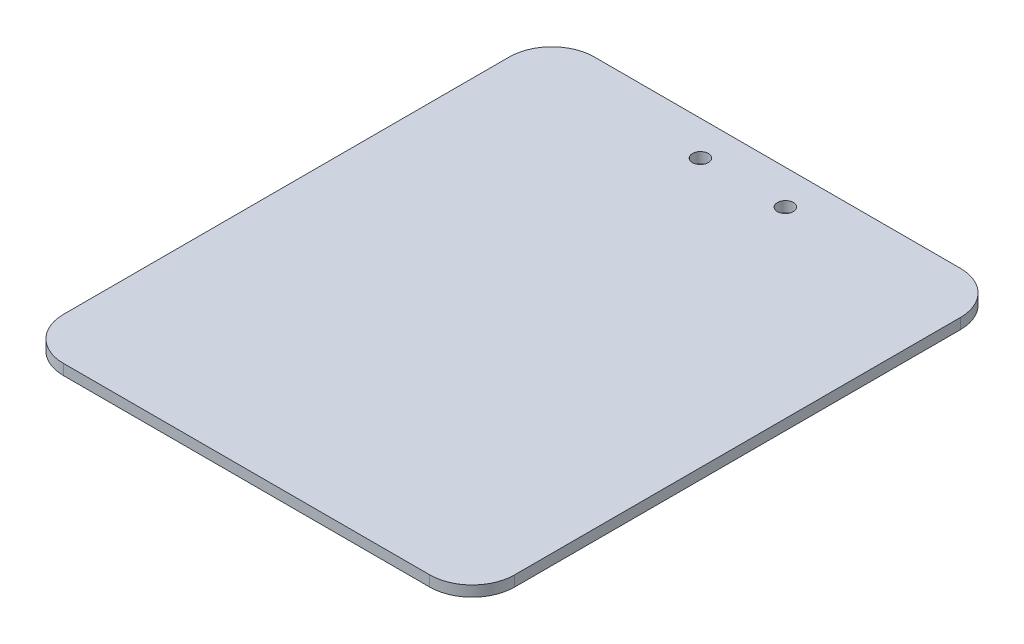
ISO-10303-21;
HEADER;
FILE_DESCRIPTION(('STEP AP214'),'2;1');
FILE_NAME('part.step','',(''),(''),'','','');
FILE_SCHEMA(('AUTOMOTIVE_DESIGN { 1 0 10303 214 1 1 1 1 }'));
ENDSEC;
DATA;
#1=APPLICATION_CONTEXT('core data for automotive mechanical design processes');
#2=APPLICATION_PROTOCOL_DEFINITION('international standard','automotive_design',2000,#1);
#3=PRODUCT_CONTEXT('',#1,'mechanical');
#4=PRODUCT('Part','Part','',(#3));
#5=PRODUCT_RELATED_PRODUCT_CATEGORY('part','',(#4));
#6=PRODUCT_DEFINITION_FORMATION('','',#4);
#7=PRODUCT_DEFINITION_CONTEXT('part definition',#1,'design');
#8=PRODUCT_DEFINITION('design','',#6,#7);
#9=PRODUCT_DEFINITION_SHAPE('','',#8);
#10=(LENGTH_UNIT() NAMED_UNIT(*) SI_UNIT(.MILLI.,.METRE.));
#11=(NAMED_UNIT(*) PLANE_ANGLE_UNIT() SI_UNIT($,.RADIAN.));
#12=(NAMED_UNIT(*) SI_UNIT($,.STERADIAN.) SOLID_ANGLE_UNIT());
#13=UNCERTAINTY_MEASURE_WITH_UNIT(LENGTH_MEASURE(1.E-05),#10,'distance_accuracy_value','');
#14=(GEOMETRIC_REPRESENTATION_CONTEXT(3) GLOBAL_UNCERTAINTY_ASSIGNED_CONTEXT((#13)) GLOBAL_UNIT_ASSIGNED_CONTEXT((#10,
#11,#12)) REPRESENTATION_CONTEXT('',''));
#15=CARTESIAN_POINT('',(0.,0.,0.));
#16=DIRECTION('',(0.,0.,1.));
#17=DIRECTION('',(1.,0.,0.));
#18=AXIS2_PLACEMENT_3D('',#15,#16,#17);
#19=CARTESIAN_POINT('',(8.,2.,-8.));
#20=DIRECTION('',(0.,-1.,0.));
#21=DIRECTION('',(0.,0.,-1.));
#22=AXIS2_PLACEMENT_3D('',#19,#20,#21);
#23=PLANE('',#22);
#24=CARTESIAN_POINT('',(8.,2.,-8.));
#25=DIRECTION('',(0.,1.,0.));
#26=DIRECTION('',(0.,0.,-1.));
#27=AXIS2_PLACEMENT_3D('',#24,#25,#26);
#28=CIRCLE('',#27,8.);
#29=CARTESIAN_POINT('',(0.,2.,-8.00000000000006));
#30=VERTEX_POINT('',#29);
#31=CARTESIAN_POINT('',(8.00000000000006,2.,0.));
#32=VERTEX_POINT('',#31);
#33=EDGE_CURVE('E170',#30,#32,#28,.T.);
#34=ORIENTED_EDGE('',*,*,#33,.T.);
#35=DIRECTION('',(1.,0.,0.));
#36=VECTOR('',#35,1.);
#37=CARTESIAN_POINT('',(8.00000000000006,2.,0.));
#38=LINE('',#37,#36);
#39=CARTESIAN_POINT('',(77.,2.,0.));
#40=VERTEX_POINT('',#39);
#41=EDGE_CURVE('E106',#32,#40,#38,.T.);
#42=ORIENTED_EDGE('',*,*,#41,.T.);
#43=CARTESIAN_POINT('',(77.,2.,-8.));
#44=DIRECTION('',(0.,1.,0.));
#45=DIRECTION('',(0.,0.,1.));
#46=AXIS2_PLACEMENT_3D('',#43,#44,#45);
#47=CIRCLE('',#46,8.);
#48=CARTESIAN_POINT('',(85.,2.,-8.00000000000006));
#49=VERTEX_POINT('',#48);
#50=EDGE_CURVE('E191',#40,#49,#47,.T.);
#51=ORIENTED_EDGE('',*,*,#50,.T.);
#52=DIRECTION('',(0.,0.,-1.));
#53=VECTOR('',#52,1.);
#54=CARTESIAN_POINT('',(85.,2.,-8.00000000000006));
#55=LINE('',#54,#53);
#56=CARTESIAN_POINT('',(85.,2.,-91.9999999999999));
#57=VERTEX_POINT('',#56);
#58=EDGE_CURVE('E205',#49,#57,#55,.T.);
#59=ORIENTED_EDGE('',*,*,#58,.T.);
#60=CARTESIAN_POINT('',(77.,2.,-92.));
#61=DIRECTION('',(0.,1.,0.));
#62=DIRECTION('',(0.,0.,-1.));
#63=AXIS2_PLACEMENT_3D('',#60,#61,#62);
#64=CIRCLE('',#63,7.99999999999999);
#65=CARTESIAN_POINT('',(76.9999999999999,2.,-100.));
#66=VERTEX_POINT('',#65);
#67=EDGE_CURVE('E125',#57,#66,#64,.T.);
#68=ORIENTED_EDGE('',*,*,#67,.T.);
#69=DIRECTION('',(-1.,0.,0.));
#70=VECTOR('',#69,1.);
#71=CARTESIAN_POINT('',(8.00000000000006,2.,-100.));
#72=LINE('',#71,#70);
#73=CARTESIAN_POINT('',(8.00000000000006,2.,-100.));
#74=VERTEX_POINT('',#73);
#75=EDGE_CURVE('E119',#66,#74,#72,.T.);
#76=ORIENTED_EDGE('',*,*,#75,.T.);
#77=CARTESIAN_POINT('',(8.,2.,-92.));
#78=DIRECTION('',(0.,1.,0.));
#79=DIRECTION('',(0.,0.,-1.));
#80=AXIS2_PLACEMENT_3D('',#77,#78,#79);
#81=CIRCLE('',#80,8.);
#82=CARTESIAN_POINT('',(0.,2.,-91.9999999999999));
#83=VERTEX_POINT('',#82);
#84=EDGE_CURVE('E123',#74,#83,#81,.T.);
#85=ORIENTED_EDGE('',*,*,#84,.T.);
#86=DIRECTION('',(0.,0.,1.));
#87=VECTOR('',#86,1.);
#88=CARTESIAN_POINT('',(0.,2.,-8.00000000000006));
#89=LINE('',#88,#87);
#90=EDGE_CURVE('E63',#83,#30,#89,.T.);
#91=ORIENTED_EDGE('',*,*,#90,.T.);
#92=EDGE_LOOP('',(#34,#42,#51,#59,#68,#76,#85,#91));
#93=FACE_BOUND('',#92,.T.);
#94=CARTESIAN_POINT('',(50.5,2.,-93.5));
#95=DIRECTION('',(0.,1.,0.));
#96=DIRECTION('',(0.,0.,1.));
#97=AXIS2_PLACEMENT_3D('',#94,#95,#96);
#98=CIRCLE('',#97,1.5);
#99=CARTESIAN_POINT('',(50.5,2.,-92.));
#100=VERTEX_POINT('',#99);
#101=EDGE_CURVE('E152',#100,#100,#98,.T.);
#102=ORIENTED_EDGE('',*,*,#101,.F.);
#103=EDGE_LOOP('',(#102));
#104=FACE_BOUND('',#103,.T.);
#105=CARTESIAN_POINT('',(34.5,2.,-93.5));
#106=DIRECTION('',(0.,1.,0.));
#107=DIRECTION('',(0.,0.,-1.));
#108=AXIS2_PLACEMENT_3D('',#105,#106,#107);
#109=CIRCLE('',#108,1.5);
#110=CARTESIAN_POINT('',(34.5,2.,-95.));
#111=VERTEX_POINT('',#110);
#112=EDGE_CURVE('E219',#111,#111,#109,.T.);
#113=ORIENTED_EDGE('',*,*,#112,.F.);
#114=EDGE_LOOP('',(#113));
#115=FACE_BOUND('',#114,.T.);
#116=ADVANCED_FACE('F45',(#93,#104,#115),#23,.F.);
#117=CARTESIAN_POINT('',(8.,0.,-8.));
#118=DIRECTION('',(0.,-1.,0.));
#119=DIRECTION('',(0.,0.,-1.));
#120=AXIS2_PLACEMENT_3D('',#117,#118,#119);
#121=PLANE('',#120);
#122=CARTESIAN_POINT('',(50.5,0.,-93.5));
#123=DIRECTION('',(0.,1.,0.));
#124=DIRECTION('',(0.,0.,1.));
#125=AXIS2_PLACEMENT_3D('',#122,#123,#124);
#126=CIRCLE('',#125,1.5);
#127=CARTESIAN_POINT('',(50.5,0.,-92.));
#128=VERTEX_POINT('',#127);
#129=EDGE_CURVE('E215',#128,#128,#126,.T.);
#130=ORIENTED_EDGE('',*,*,#129,.T.);
#131=EDGE_LOOP('',(#130));
#132=FACE_BOUND('',#131,.T.);
#133=CARTESIAN_POINT('',(8.,0.,-8.));
#134=DIRECTION('',(0.,1.,0.));
#135=DIRECTION('',(0.,0.,-1.));
#136=AXIS2_PLACEMENT_3D('',#133,#134,#135);
#137=CIRCLE('',#136,8.);
#138=CARTESIAN_POINT('',(0.,0.,-8.00000000000006));
#139=VERTEX_POINT('',#138);
#140=CARTESIAN_POINT('',(8.00000000000006,0.,0.));
#141=VERTEX_POINT('',#140);
#142=EDGE_CURVE('E147',#139,#141,#137,.T.);
#143=ORIENTED_EDGE('',*,*,#142,.F.);
#144=DIRECTION('',(0.,0.,1.));
#145=VECTOR('',#144,1.);
#146=CARTESIAN_POINT('',(0.,0.,-8.00000000000006));
#147=LINE('',#146,#145);
#148=CARTESIAN_POINT('',(0.,0.,-91.9999999999999));
#149=VERTEX_POINT('',#148);
#150=EDGE_CURVE('E98',#149,#139,#147,.T.);
#151=ORIENTED_EDGE('',*,*,#150,.F.);
#152=CARTESIAN_POINT('',(8.,0.,-92.));
#153=DIRECTION('',(0.,1.,0.));
#154=DIRECTION('',(0.,0.,-1.));
#155=AXIS2_PLACEMENT_3D('',#152,#153,#154);
#156=CIRCLE('',#155,8.);
#157=CARTESIAN_POINT('',(8.00000000000006,0.,-100.));
#158=VERTEX_POINT('',#157);
#159=EDGE_CURVE('E92',#158,#149,#156,.T.);
#160=ORIENTED_EDGE('',*,*,#159,.F.);
#161=DIRECTION('',(-1.,0.,0.));
#162=VECTOR('',#161,1.);
#163=CARTESIAN_POINT('',(8.00000000000006,0.,-100.));
#164=LINE('',#163,#162);
#165=CARTESIAN_POINT('',(76.9999999999999,0.,-100.));
#166=VERTEX_POINT('',#165);
#167=EDGE_CURVE('E134',#166,#158,#164,.T.);
#168=ORIENTED_EDGE('',*,*,#167,.F.);
#169=CARTESIAN_POINT('',(77.,0.,-92.));
#170=DIRECTION('',(0.,1.,0.));
#171=DIRECTION('',(0.,0.,-1.));
#172=AXIS2_PLACEMENT_3D('',#169,#170,#171);
#173=CIRCLE('',#172,7.99999999999999);
#174=CARTESIAN_POINT('',(85.,0.,-91.9999999999999));
#175=VERTEX_POINT('',#174);
#176=EDGE_CURVE('E161',#175,#166,#173,.T.);
#177=ORIENTED_EDGE('',*,*,#176,.F.);
#178=DIRECTION('',(0.,0.,-1.));
#179=VECTOR('',#178,1.);
#180=CARTESIAN_POINT('',(85.,0.,-8.00000000000006));
#181=LINE('',#180,#179);
#182=CARTESIAN_POINT('',(85.,0.,-8.00000000000006));
#183=VERTEX_POINT('',#182);
#184=EDGE_CURVE('E158',#183,#175,#181,.T.);
#185=ORIENTED_EDGE('',*,*,#184,.F.);
#186=CARTESIAN_POINT('',(77.,0.,-8.));
#187=DIRECTION('',(0.,1.,0.));
#188=DIRECTION('',(0.,0.,1.));
#189=AXIS2_PLACEMENT_3D('',#186,#187,#188);
#190=CIRCLE('',#189,8.);
#191=CARTESIAN_POINT('',(77.,0.,0.));
#192=VERTEX_POINT('',#191);
#193=EDGE_CURVE('E155',#192,#183,#190,.T.);
#194=ORIENTED_EDGE('',*,*,#193,.F.);
#195=DIRECTION('',(1.,0.,0.));
#196=VECTOR('',#195,1.);
#197=CARTESIAN_POINT('',(8.00000000000006,0.,0.));
#198=LINE('',#197,#196);
#199=EDGE_CURVE('E151',#141,#192,#198,.T.);
#200=ORIENTED_EDGE('',*,*,#199,.F.);
#201=EDGE_LOOP('',(#143,#151,#160,#168,#177,#185,#194,#200));
#202=FACE_BOUND('',#201,.T.);
#203=CARTESIAN_POINT('',(34.5,0.,-93.5));
#204=DIRECTION('',(0.,1.,0.));
#205=DIRECTION('',(0.,0.,-1.));
#206=AXIS2_PLACEMENT_3D('',#203,#204,#205);
#207=CIRCLE('',#206,1.5);
#208=CARTESIAN_POINT('',(34.5,0.,-95.));
#209=VERTEX_POINT('',#208);
#210=EDGE_CURVE('E223',#209,#209,#207,.T.);
#211=ORIENTED_EDGE('',*,*,#210,.T.);
#212=EDGE_LOOP('',(#211));
#213=FACE_BOUND('',#212,.T.);
#214=ADVANCED_FACE('F195',(#132,#202,#213),#121,.T.);
#215=CARTESIAN_POINT('',(8.,2.,-8.));
#216=DIRECTION('',(0.,-1.,0.));
#217=DIRECTION('',(0.,0.,-1.));
#218=AXIS2_PLACEMENT_3D('',#215,#216,#217);
#219=CYLINDRICAL_SURFACE('',#218,8.);
#220=ORIENTED_EDGE('',*,*,#142,.T.);
#221=DIRECTION('',(0.,-1.,0.));
#222=VECTOR('',#221,1.);
#223=CARTESIAN_POINT('',(8.00000000000006,2.,0.));
#224=LINE('',#223,#222);
#225=EDGE_CURVE('E11',#32,#141,#224,.T.);
#226=ORIENTED_EDGE('',*,*,#225,.F.);
#227=ORIENTED_EDGE('',*,*,#33,.F.);
#228=DIRECTION('',(0.,-1.,0.));
#229=VECTOR('',#228,1.);
#230=CARTESIAN_POINT('',(0.,2.,-8.00000000000006));
#231=LINE('',#230,#229);
#232=EDGE_CURVE('E143',#30,#139,#231,.T.);
#233=ORIENTED_EDGE('',*,*,#232,.T.);
#234=EDGE_LOOP('',(#220,#226,#227,#233));
#235=FACE_BOUND('',#234,.T.);
#236=ADVANCED_FACE('F47',(#235),#219,.T.);
#237=CARTESIAN_POINT('',(8.00000000000006,2.,0.));
#238=DIRECTION('',(0.,0.,-1.));
#239=DIRECTION('',(-1.,0.,0.));
#240=AXIS2_PLACEMENT_3D('',#237,#238,#239);
#241=PLANE('',#240);
#242=ORIENTED_EDGE('',*,*,#199,.T.);
#243=DIRECTION('',(0.,-1.,0.));
#244=VECTOR('',#243,1.);
#245=CARTESIAN_POINT('',(77.,2.,0.));
#246=LINE('',#245,#244);
#247=EDGE_CURVE('E55',#40,#192,#246,.T.);
#248=ORIENTED_EDGE('',*,*,#247,.F.);
#249=ORIENTED_EDGE('',*,*,#41,.F.);
#250=ORIENTED_EDGE('',*,*,#225,.T.);
#251=EDGE_LOOP('',(#242,#248,#249,#250));
#252=FACE_BOUND('',#251,.T.);
#253=ADVANCED_FACE('F257',(#252),#241,.F.);
#254=CARTESIAN_POINT('',(77.,2.,-8.));
#255=DIRECTION('',(0.,-1.,0.));
#256=DIRECTION('',(0.,0.,-1.));
#257=AXIS2_PLACEMENT_3D('',#254,#255,#256);
#258=CYLINDRICAL_SURFACE('',#257,8.);
#259=ORIENTED_EDGE('',*,*,#193,.T.);
#260=DIRECTION('',(0.,-1.,0.));
#261=VECTOR('',#260,1.);
#262=CARTESIAN_POINT('',(85.,2.,-8.00000000000006));
#263=LINE('',#262,#261);
#264=EDGE_CURVE('E181',#49,#183,#263,.T.);
#265=ORIENTED_EDGE('',*,*,#264,.F.);
#266=ORIENTED_EDGE('',*,*,#50,.F.);
#267=ORIENTED_EDGE('',*,*,#247,.T.);
#268=EDGE_LOOP('',(#259,#265,#266,#267));
#269=FACE_BOUND('',#268,.T.);
#270=ADVANCED_FACE('F189',(#269),#258,.T.);
#271=CARTESIAN_POINT('',(85.,2.,-8.00000000000006));
#272=DIRECTION('',(-1.,0.,0.));
#273=DIRECTION('',(0.,0.,1.));
#274=AXIS2_PLACEMENT_3D('',#271,#272,#273);
#275=PLANE('',#274);
#276=ORIENTED_EDGE('',*,*,#184,.T.);
#277=DIRECTION('',(0.,-1.,0.));
#278=VECTOR('',#277,1.);
#279=CARTESIAN_POINT('',(85.,2.,-91.9999999999999));
#280=LINE('',#279,#278);
#281=EDGE_CURVE('E177',#57,#175,#280,.T.);
#282=ORIENTED_EDGE('',*,*,#281,.F.);
#283=ORIENTED_EDGE('',*,*,#58,.F.);
#284=ORIENTED_EDGE('',*,*,#264,.T.);
#285=EDGE_LOOP('',(#276,#282,#283,#284));
#286=FACE_BOUND('',#285,.T.);
#287=ADVANCED_FACE('F200',(#286),#275,.F.);
#288=CARTESIAN_POINT('',(77.,2.,-92.));
#289=DIRECTION('',(0.,-1.,0.));
#290=DIRECTION('',(0.,0.,-1.));
#291=AXIS2_PLACEMENT_3D('',#288,#289,#290);
#292=CYLINDRICAL_SURFACE('',#291,7.99999999999999);
#293=ORIENTED_EDGE('',*,*,#176,.T.);
#294=DIRECTION('',(0.,-1.,0.));
#295=VECTOR('',#294,1.);
#296=CARTESIAN_POINT('',(76.9999999999999,2.,-100.));
#297=LINE('',#296,#295);
#298=EDGE_CURVE('E136',#66,#166,#297,.T.);
#299=ORIENTED_EDGE('',*,*,#298,.F.);
#300=ORIENTED_EDGE('',*,*,#67,.F.);
#301=ORIENTED_EDGE('',*,*,#281,.T.);
#302=EDGE_LOOP('',(#293,#299,#300,#301));
#303=FACE_BOUND('',#302,.T.);
#304=ADVANCED_FACE('F203',(#303),#292,.T.);
#305=CARTESIAN_POINT('',(8.00000000000006,2.,-100.));
#306=DIRECTION('',(0.,0.,1.));
#307=DIRECTION('',(1.,0.,0.));
#308=AXIS2_PLACEMENT_3D('',#305,#306,#307);
#309=PLANE('',#308);
#310=ORIENTED_EDGE('',*,*,#167,.T.);
#311=DIRECTION('',(0.,-1.,0.));
#312=VECTOR('',#311,1.);
#313=CARTESIAN_POINT('',(8.00000000000006,2.,-100.));
#314=LINE('',#313,#312);
#315=EDGE_CURVE('E131',#74,#158,#314,.T.);
#316=ORIENTED_EDGE('',*,*,#315,.F.);
#317=ORIENTED_EDGE('',*,*,#75,.F.);
#318=ORIENTED_EDGE('',*,*,#298,.T.);
#319=EDGE_LOOP('',(#310,#316,#317,#318));
#320=FACE_BOUND('',#319,.T.);
#321=ADVANCED_FACE('F132',(#320),#309,.F.);
#322=CARTESIAN_POINT('',(8.,2.,-92.));
#323=DIRECTION('',(0.,-1.,0.));
#324=DIRECTION('',(0.,0.,-1.));
#325=AXIS2_PLACEMENT_3D('',#322,#323,#324);
#326=CYLINDRICAL_SURFACE('',#325,8.);
#327=ORIENTED_EDGE('',*,*,#159,.T.);
#328=DIRECTION('',(0.,-1.,0.));
#329=VECTOR('',#328,1.);
#330=CARTESIAN_POINT('',(0.,2.,-91.9999999999999));
#331=LINE('',#330,#329);
#332=EDGE_CURVE('E137',#83,#149,#331,.T.);
#333=ORIENTED_EDGE('',*,*,#332,.F.);
#334=ORIENTED_EDGE('',*,*,#84,.F.);
#335=ORIENTED_EDGE('',*,*,#315,.T.);
#336=EDGE_LOOP('',(#327,#333,#334,#335));
#337=FACE_BOUND('',#336,.T.);
#338=ADVANCED_FACE('F139',(#337),#326,.T.);
#339=CARTESIAN_POINT('',(0.,2.,-8.00000000000006));
#340=DIRECTION('',(1.,0.,0.));
#341=DIRECTION('',(0.,0.,-1.));
#342=AXIS2_PLACEMENT_3D('',#339,#340,#341);
#343=PLANE('',#342);
#344=ORIENTED_EDGE('',*,*,#150,.T.);
#345=ORIENTED_EDGE('',*,*,#232,.F.);
#346=ORIENTED_EDGE('',*,*,#90,.F.);
#347=ORIENTED_EDGE('',*,*,#332,.T.);
#348=EDGE_LOOP('',(#344,#345,#346,#347));
#349=FACE_BOUND('',#348,.T.);
#350=ADVANCED_FACE('F245',(#349),#343,.F.);
#351=CARTESIAN_POINT('',(50.5,2.,-93.5));
#352=DIRECTION('',(0.,-1.,0.));
#353=DIRECTION('',(0.,0.,-1.));
#354=AXIS2_PLACEMENT_3D('',#351,#352,#353);
#355=CYLINDRICAL_SURFACE('',#354,1.5);
#356=ORIENTED_EDGE('',*,*,#101,.T.);
#357=EDGE_LOOP('',(#356));
#358=FACE_BOUND('',#357,.T.);
#359=ORIENTED_EDGE('',*,*,#129,.F.);
#360=EDGE_LOOP('',(#359));
#361=FACE_BOUND('',#360,.T.);
#362=ADVANCED_FACE('F242',(#358,#361),#355,.F.);
#363=CARTESIAN_POINT('',(34.5,2.,-93.5));
#364=DIRECTION('',(0.,-1.,0.));
#365=DIRECTION('',(0.,0.,-1.));
#366=AXIS2_PLACEMENT_3D('',#363,#364,#365);
#367=CYLINDRICAL_SURFACE('',#366,1.5);
#368=ORIENTED_EDGE('',*,*,#112,.T.);
#369=EDGE_LOOP('',(#368));
#370=FACE_BOUND('',#369,.T.);
#371=ORIENTED_EDGE('',*,*,#210,.F.);
#372=EDGE_LOOP('',(#371));
#373=FACE_BOUND('',#372,.T.);
#374=ADVANCED_FACE('F231',(#370,#373),#367,.F.);
#375=CLOSED_SHELL('',(#116,#214,#236,#253,#270,#287,#304,#321,#338,#350,#362,#374));
#376=MANIFOLD_SOLID_BREP('B2',#375);
#377=ADVANCED_BREP_SHAPE_REPRESENTATION('',(#18,#376),#14);
#378=SHAPE_DEFINITION_REPRESENTATION(#9,#377);
ENDSEC;
END-ISO-10303-21;
